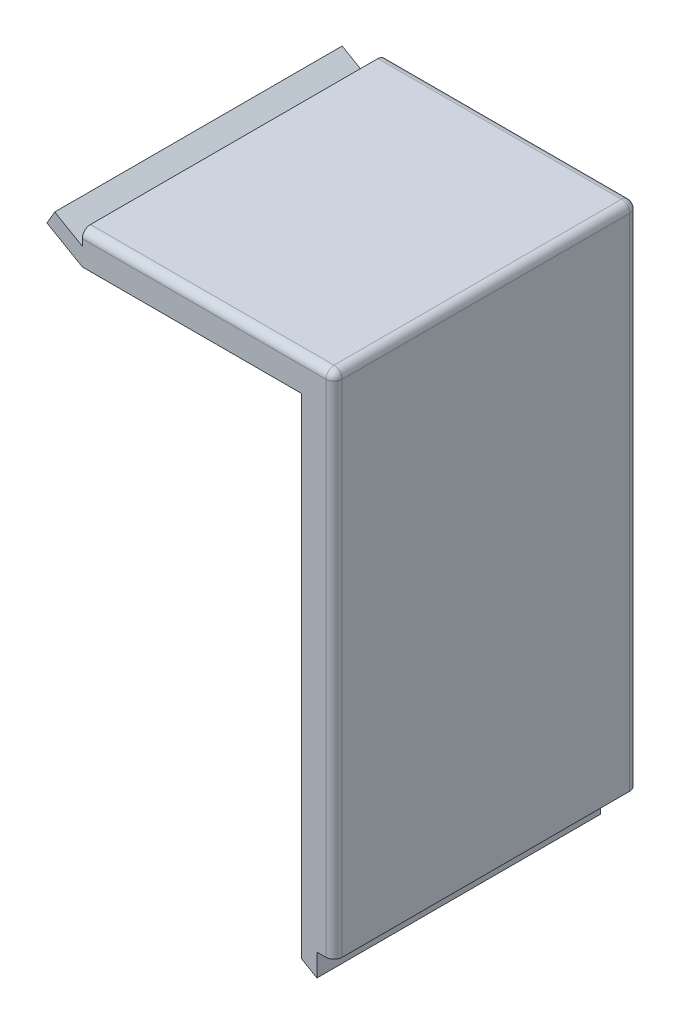
ISO-10303-21;
HEADER;
FILE_DESCRIPTION(('STEP AP214'),'2;1');
FILE_NAME('part.step','',(''),(''),'','','');
FILE_SCHEMA(('AUTOMOTIVE_DESIGN { 1 0 10303 214 1 1 1 1 }'));
ENDSEC;
DATA;
#1=APPLICATION_CONTEXT('core data for automotive mechanical design processes');
#2=APPLICATION_PROTOCOL_DEFINITION('international standard','automotive_design',2000,#1);
#3=PRODUCT_CONTEXT('',#1,'mechanical');
#4=PRODUCT('Part','Part','',(#3));
#5=PRODUCT_RELATED_PRODUCT_CATEGORY('part','',(#4));
#6=PRODUCT_DEFINITION_FORMATION('','',#4);
#7=PRODUCT_DEFINITION_CONTEXT('part definition',#1,'design');
#8=PRODUCT_DEFINITION('design','',#6,#7);
#9=PRODUCT_DEFINITION_SHAPE('','',#8);
#10=(LENGTH_UNIT() NAMED_UNIT(*) SI_UNIT(.MILLI.,.METRE.));
#11=(NAMED_UNIT(*) PLANE_ANGLE_UNIT() SI_UNIT($,.RADIAN.));
#12=(NAMED_UNIT(*) SI_UNIT($,.STERADIAN.) SOLID_ANGLE_UNIT());
#13=UNCERTAINTY_MEASURE_WITH_UNIT(LENGTH_MEASURE(1.E-05),#10,'distance_accuracy_value','');
#14=(GEOMETRIC_REPRESENTATION_CONTEXT(3) GLOBAL_UNCERTAINTY_ASSIGNED_CONTEXT((#13)) GLOBAL_UNIT_ASSIGNED_CONTEXT((#10,
#11,#12)) REPRESENTATION_CONTEXT('',''));
#15=CARTESIAN_POINT('',(0.,0.,0.));
#16=DIRECTION('',(0.,0.,1.));
#17=DIRECTION('',(1.,0.,0.));
#18=AXIS2_PLACEMENT_3D('',#15,#16,#17);
#19=CARTESIAN_POINT('',(54.4568146972271,1.89908309852391E-13,10.));
#20=DIRECTION('',(-1.,0.,0.));
#21=DIRECTION('',(0.,-1.,0.));
#22=AXIS2_PLACEMENT_3D('',#19,#20,#21);
#23=PLANE('',#22);
#24=DIRECTION('',(0.,0.,-1.));
#25=VECTOR('',#24,1.);
#26=CARTESIAN_POINT('',(54.4568146972267,119.96219663255,10.));
#27=LINE('',#26,#25);
#28=CARTESIAN_POINT('',(54.4568146972267,119.96219663255,72.5));
#29=VERTEX_POINT('',#28);
#30=CARTESIAN_POINT('',(54.4568146972267,119.96219663255,2.));
#31=VERTEX_POINT('',#30);
#32=EDGE_CURVE('E258',#29,#31,#27,.T.);
#33=ORIENTED_EDGE('',*,*,#32,.T.);
#34=CARTESIAN_POINT('',(54.4568146972267,117.96219663255,2.));
#35=DIRECTION('',(-1.,0.,0.));
#36=DIRECTION('',(0.,-1.,0.));
#37=AXIS2_PLACEMENT_3D('',#34,#35,#36);
#38=CIRCLE('',#37,2.);
#39=CARTESIAN_POINT('',(54.4568146972267,117.96219663255,0.));
#40=VERTEX_POINT('',#39);
#41=EDGE_CURVE('E295',#31,#40,#38,.T.);
#42=ORIENTED_EDGE('',*,*,#41,.T.);
#43=DIRECTION('',(0.,1.,0.));
#44=VECTOR('',#43,1.);
#45=CARTESIAN_POINT('',(54.4568146972271,1.89908309852391E-13,0.));
#46=LINE('',#45,#44);
#47=CARTESIAN_POINT('',(54.456814697227,40.3721966325497,0.));
#48=VERTEX_POINT('',#47);
#49=EDGE_CURVE('E221',#48,#40,#46,.T.);
#50=ORIENTED_EDGE('',*,*,#49,.F.);
#51=DIRECTION('',(0.,0.,-1.));
#52=VECTOR('',#51,1.);
#53=CARTESIAN_POINT('',(54.456814697227,40.3721966325497,10.));
#54=LINE('',#53,#52);
#55=CARTESIAN_POINT('',(54.456814697227,40.3721966325497,10.));
#56=VERTEX_POINT('',#55);
#57=EDGE_CURVE('E255',#56,#48,#54,.T.);
#58=ORIENTED_EDGE('',*,*,#57,.F.);
#59=DIRECTION('',(0.,1.,0.));
#60=VECTOR('',#59,1.);
#61=CARTESIAN_POINT('',(54.4568146972271,1.89908309852391E-13,10.));
#62=LINE('',#61,#60);
#63=CARTESIAN_POINT('',(54.4568146972267,111.96219663255,9.99999999999999));
#64=VERTEX_POINT('',#63);
#65=EDGE_CURVE('E242',#56,#64,#62,.T.);
#66=ORIENTED_EDGE('',*,*,#65,.T.);
#67=DIRECTION('',(0.,0.,1.));
#68=VECTOR('',#67,1.);
#69=CARTESIAN_POINT('',(54.4568146972267,111.96219663255,4.));
#70=LINE('',#69,#68);
#71=CARTESIAN_POINT('',(54.4568146972267,111.96219663255,4.));
#72=VERTEX_POINT('',#71);
#73=EDGE_CURVE('E345',#72,#64,#70,.T.);
#74=ORIENTED_EDGE('',*,*,#73,.F.);
#75=DIRECTION('',(0.,-1.,0.));
#76=VECTOR('',#75,1.);
#77=CARTESIAN_POINT('',(54.4568146972271,1.89908309852391E-13,4.));
#78=LINE('',#77,#76);
#79=CARTESIAN_POINT('',(54.4568146972267,116.350058678391,4.));
#80=VERTEX_POINT('',#79);
#81=EDGE_CURVE('E338',#80,#72,#78,.T.);
#82=ORIENTED_EDGE('',*,*,#81,.F.);
#83=DIRECTION('',(0.,0.,1.));
#84=VECTOR('',#83,1.);
#85=CARTESIAN_POINT('',(54.4568146972267,116.350058678391,4.));
#86=LINE('',#85,#84);
#87=CARTESIAN_POINT('',(54.4568146972267,116.350058678391,74.5));
#88=VERTEX_POINT('',#87);
#89=EDGE_CURVE('E341',#80,#88,#86,.T.);
#90=ORIENTED_EDGE('',*,*,#89,.T.);
#91=DIRECTION('',(0.,-1.,0.));
#92=VECTOR('',#91,1.);
#93=CARTESIAN_POINT('',(54.4568146972271,1.89908309852391E-13,74.5));
#94=LINE('',#93,#92);
#95=CARTESIAN_POINT('',(54.4568146972267,117.96219663255,74.5));
#96=VERTEX_POINT('',#95);
#97=EDGE_CURVE('E392',#96,#88,#94,.T.);
#98=ORIENTED_EDGE('',*,*,#97,.F.);
#99=CARTESIAN_POINT('',(54.4568146972267,117.96219663255,72.5));
#100=DIRECTION('',(-1.,0.,0.));
#101=DIRECTION('',(0.,-1.,0.));
#102=AXIS2_PLACEMENT_3D('',#99,#100,#101);
#103=CIRCLE('',#102,2.);
#104=EDGE_CURVE('E292',#96,#29,#103,.T.);
#105=ORIENTED_EDGE('',*,*,#104,.T.);
#106=EDGE_LOOP('',(#33,#42,#50,#58,#66,#74,#82,#90,#98,#105));
#107=FACE_BOUND('',#106,.T.);
#108=ADVANCED_FACE('F40',(#107),#23,.T.);
#109=CARTESIAN_POINT('',(0.,-4.79728263713709,10.));
#110=DIRECTION('',(0.,1.,0.));
#111=DIRECTION('',(-1.,0.,0.));
#112=AXIS2_PLACEMENT_3D('',#109,#110,#111);
#113=PLANE('',#112);
#114=DIRECTION('',(1.,0.,0.));
#115=VECTOR('',#114,1.);
#116=CARTESIAN_POINT('',(0.,-4.79728263713709,0.));
#117=LINE('',#116,#115);
#118=CARTESIAN_POINT('',(102.474735941941,-4.79728263713505,0.));
#119=VERTEX_POINT('',#118);
#120=CARTESIAN_POINT('',(114.20678674951,-4.79728263713485,0.));
#121=VERTEX_POINT('',#120);
#122=EDGE_CURVE('E58',#119,#121,#117,.T.);
#123=ORIENTED_EDGE('',*,*,#122,.T.);
#124=CARTESIAN_POINT('',(114.20678674951,-4.79728263713485,2.));
#125=DIRECTION('',(0.,1.,0.));
#126=DIRECTION('',(-1.,0.,0.));
#127=AXIS2_PLACEMENT_3D('',#124,#125,#126);
#128=CIRCLE('',#127,2.);
#129=CARTESIAN_POINT('',(116.20678674951,-4.79728263713481,2.));
#130=VERTEX_POINT('',#129);
#131=EDGE_CURVE('E271',#121,#130,#128,.F.);
#132=ORIENTED_EDGE('',*,*,#131,.T.);
#133=DIRECTION('',(0.,0.,-1.));
#134=VECTOR('',#133,1.);
#135=CARTESIAN_POINT('',(116.20678674951,-4.79728263713481,10.));
#136=LINE('',#135,#134);
#137=CARTESIAN_POINT('',(116.20678674951,-4.79728263713481,72.5));
#138=VERTEX_POINT('',#137);
#139=EDGE_CURVE('E200',#138,#130,#136,.T.);
#140=ORIENTED_EDGE('',*,*,#139,.F.);
#141=CARTESIAN_POINT('',(114.20678674951,-4.79728263713485,72.5));
#142=DIRECTION('',(0.,1.,0.));
#143=DIRECTION('',(-1.,0.,0.));
#144=AXIS2_PLACEMENT_3D('',#141,#142,#143);
#145=CIRCLE('',#144,2.);
#146=CARTESIAN_POINT('',(114.20678674951,-4.79728263713485,74.5));
#147=VERTEX_POINT('',#146);
#148=EDGE_CURVE('E268',#138,#147,#145,.F.);
#149=ORIENTED_EDGE('',*,*,#148,.T.);
#150=DIRECTION('',(1.,0.,0.));
#151=VECTOR('',#150,1.);
#152=CARTESIAN_POINT('',(0.,-4.79728263713709,74.5));
#153=LINE('',#152,#151);
#154=CARTESIAN_POINT('',(112.006786749508,-4.79728263713489,74.5));
#155=VERTEX_POINT('',#154);
#156=EDGE_CURVE('E388',#155,#147,#153,.T.);
#157=ORIENTED_EDGE('',*,*,#156,.F.);
#158=DIRECTION('',(0.,0.,1.));
#159=VECTOR('',#158,1.);
#160=CARTESIAN_POINT('',(112.006786749508,-4.7972826371349,74.5));
#161=LINE('',#160,#159);
#162=CARTESIAN_POINT('',(112.006786749508,-4.7972826371349,5.));
#163=VERTEX_POINT('',#162);
#164=EDGE_CURVE('E368',#163,#155,#161,.T.);
#165=ORIENTED_EDGE('',*,*,#164,.F.);
#166=DIRECTION('',(1.,0.,0.));
#167=VECTOR('',#166,1.);
#168=CARTESIAN_POINT('',(108.206786749508,-4.79728263713497,5.));
#169=LINE('',#168,#167);
#170=CARTESIAN_POINT('',(108.206786749508,-4.79728263713497,5.));
#171=VERTEX_POINT('',#170);
#172=EDGE_CURVE('E365',#171,#163,#169,.T.);
#173=ORIENTED_EDGE('',*,*,#172,.F.);
#174=DIRECTION('',(0.,0.,-1.));
#175=VECTOR('',#174,1.);
#176=CARTESIAN_POINT('',(108.206786749508,-4.79728263713497,74.5));
#177=LINE('',#176,#175);
#178=CARTESIAN_POINT('',(108.206786749508,-4.79728263713497,9.99999999999999));
#179=VERTEX_POINT('',#178);
#180=EDGE_CURVE('E195',#179,#171,#177,.T.);
#181=ORIENTED_EDGE('',*,*,#180,.F.);
#182=DIRECTION('',(1.,0.,0.));
#183=VECTOR('',#182,1.);
#184=CARTESIAN_POINT('',(0.,-4.79728263713709,10.));
#185=LINE('',#184,#183);
#186=CARTESIAN_POINT('',(102.474735941941,-4.79728263713504,9.99999999999999));
#187=VERTEX_POINT('',#186);
#188=EDGE_CURVE('E189',#187,#179,#185,.T.);
#189=ORIENTED_EDGE('',*,*,#188,.F.);
#190=DIRECTION('',(0.,0.,-1.));
#191=VECTOR('',#190,1.);
#192=CARTESIAN_POINT('',(102.474735941941,-4.79728263713504,74.501));
#193=LINE('',#192,#191);
#194=EDGE_CURVE('E192',#187,#119,#193,.T.);
#195=ORIENTED_EDGE('',*,*,#194,.T.);
#196=EDGE_LOOP('',(#123,#132,#140,#149,#157,#165,#173,#181,#189,#195));
#197=FACE_BOUND('',#196,.T.);
#198=ADVANCED_FACE('F191',(#197),#113,.F.);
#199=CARTESIAN_POINT('',(0.,0.,10.));
#200=DIRECTION('',(0.,0.,1.));
#201=DIRECTION('',(1.,0.,0.));
#202=AXIS2_PLACEMENT_3D('',#199,#200,#201);
#203=PLANE('',#202);
#204=DIRECTION('',(0.866025403784446,-0.499999999999987,0.));
#205=VECTOR('',#204,1.);
#206=CARTESIAN_POINT('',(23.5413996690376,40.7749003080596,10.));
#207=LINE('',#206,#205);
#208=CARTESIAN_POINT('',(69.5657705981324,14.2027173628645,10.));
#209=VERTEX_POINT('',#208);
#210=EDGE_CURVE('E201',#209,#187,#207,.T.);
#211=ORIENTED_EDGE('',*,*,#210,.T.);
#212=ORIENTED_EDGE('',*,*,#188,.T.);
#213=DIRECTION('',(0.,1.,0.));
#214=VECTOR('',#213,1.);
#215=CARTESIAN_POINT('',(108.206786749508,0.,10.));
#216=LINE('',#215,#214);
#217=CARTESIAN_POINT('',(108.206786749508,111.96219663255,10.));
#218=VERTEX_POINT('',#217);
#219=EDGE_CURVE('E383',#179,#218,#216,.T.);
#220=ORIENTED_EDGE('',*,*,#219,.T.);
#221=DIRECTION('',(1.,0.,0.));
#222=VECTOR('',#221,1.);
#223=CARTESIAN_POINT('',(0.,111.96219663255,10.));
#224=LINE('',#223,#222);
#225=EDGE_CURVE('E389',#64,#218,#224,.T.);
#226=ORIENTED_EDGE('',*,*,#225,.F.);
#227=ORIENTED_EDGE('',*,*,#65,.F.);
#228=DIRECTION('',(1.,0.,0.));
#229=VECTOR('',#228,1.);
#230=CARTESIAN_POINT('',(-6.91376316339102E-13,40.3721966325488,10.));
#231=LINE('',#230,#229);
#232=CARTESIAN_POINT('',(46.5547264990387,40.3721966325496,10.));
#233=VERTEX_POINT('',#232);
#234=EDGE_CURVE('E413',#233,#56,#231,.T.);
#235=ORIENTED_EDGE('',*,*,#234,.F.);
#236=DIRECTION('',(0.499999999999984,-0.866025403784448,0.));
#237=VECTOR('',#236,1.);
#238=CARTESIAN_POINT('',(52.3977188194636,30.2518370653384,10.));
#239=LINE('',#238,#237);
#240=CARTESIAN_POINT('',(65.6147264990377,7.35930824028713,10.));
#241=VERTEX_POINT('',#240);
#242=EDGE_CURVE('E217',#233,#241,#239,.T.);
#243=ORIENTED_EDGE('',*,*,#242,.T.);
#244=DIRECTION('',(-0.499999999999991,-0.866025403784444,0.));
#245=VECTOR('',#244,1.);
#246=CARTESIAN_POINT('',(46.0243709290945,-26.5721829451953,10.));
#247=LINE('',#246,#245);
#248=EDGE_CURVE('E213',#209,#241,#247,.T.);
#249=ORIENTED_EDGE('',*,*,#248,.F.);
#250=EDGE_LOOP('',(#211,#212,#220,#226,#227,#235,#243,#249));
#251=FACE_BOUND('',#250,.T.);
#252=ADVANCED_FACE('F211',(#251),#203,.T.);
#253=CARTESIAN_POINT('',(116.20678674951,1.87433055169684E-12,10.));
#254=DIRECTION('',(1.,0.,0.));
#255=DIRECTION('',(0.,1.,0.));
#256=AXIS2_PLACEMENT_3D('',#253,#254,#255);
#257=PLANE('',#256);
#258=ORIENTED_EDGE('',*,*,#139,.T.);
#259=DIRECTION('',(0.,-1.,0.));
#260=VECTOR('',#259,1.);
#261=CARTESIAN_POINT('',(116.206786749508,119.96219663255,2.));
#262=LINE('',#261,#260);
#263=CARTESIAN_POINT('',(116.206786749508,117.96219663255,2.));
#264=VERTEX_POINT('',#263);
#265=EDGE_CURVE('E280',#130,#264,#262,.F.);
#266=ORIENTED_EDGE('',*,*,#265,.T.);
#267=DIRECTION('',(0.,0.,-1.));
#268=VECTOR('',#267,1.);
#269=CARTESIAN_POINT('',(116.206786749508,117.96219663255,10.));
#270=LINE('',#269,#268);
#271=CARTESIAN_POINT('',(116.206786749508,117.96219663255,72.5));
#272=VERTEX_POINT('',#271);
#273=EDGE_CURVE('E277',#264,#272,#270,.F.);
#274=ORIENTED_EDGE('',*,*,#273,.T.);
#275=DIRECTION('',(0.,1.,0.));
#276=VECTOR('',#275,1.);
#277=CARTESIAN_POINT('',(116.20678674951,1.87433055169684E-12,72.5));
#278=LINE('',#277,#276);
#279=EDGE_CURVE('E274',#272,#138,#278,.F.);
#280=ORIENTED_EDGE('',*,*,#279,.T.);
#281=EDGE_LOOP('',(#258,#266,#274,#280));
#282=FACE_BOUND('',#281,.T.);
#283=ADVANCED_FACE('F450',(#282),#257,.T.);
#284=CARTESIAN_POINT('',(0.,119.96219663255,10.));
#285=DIRECTION('',(0.,1.,0.));
#286=DIRECTION('',(0.,0.,1.));
#287=AXIS2_PLACEMENT_3D('',#284,#285,#286);
#288=PLANE('',#287);
#289=DIRECTION('',(0.,0.,-1.));
#290=VECTOR('',#289,1.);
#291=CARTESIAN_POINT('',(114.206786749508,119.96219663255,10.));
#292=LINE('',#291,#290);
#293=CARTESIAN_POINT('',(114.206786749508,119.96219663255,72.5));
#294=VERTEX_POINT('',#293);
#295=CARTESIAN_POINT('',(114.206786749508,119.96219663255,2.));
#296=VERTEX_POINT('',#295);
#297=EDGE_CURVE('E286',#294,#296,#292,.T.);
#298=ORIENTED_EDGE('',*,*,#297,.T.);
#299=DIRECTION('',(1.,0.,0.));
#300=VECTOR('',#299,1.);
#301=CARTESIAN_POINT('',(54.4568146972267,119.96219663255,2.));
#302=LINE('',#301,#300);
#303=EDGE_CURVE('E289',#296,#31,#302,.F.);
#304=ORIENTED_EDGE('',*,*,#303,.T.);
#305=ORIENTED_EDGE('',*,*,#32,.F.);
#306=DIRECTION('',(-1.,0.,0.));
#307=VECTOR('',#306,1.);
#308=CARTESIAN_POINT('',(0.,119.96219663255,72.5));
#309=LINE('',#308,#307);
#310=EDGE_CURVE('E283',#29,#294,#309,.F.);
#311=ORIENTED_EDGE('',*,*,#310,.T.);
#312=EDGE_LOOP('',(#298,#304,#305,#311));
#313=FACE_BOUND('',#312,.T.);
#314=ADVANCED_FACE('F489',(#313),#288,.T.);
#315=CARTESIAN_POINT('',(-6.91376316339102E-13,40.3721966325488,10.));
#316=DIRECTION('',(0.,1.,0.));
#317=DIRECTION('',(-1.,0.,0.));
#318=AXIS2_PLACEMENT_3D('',#315,#316,#317);
#319=PLANE('',#318);
#320=DIRECTION('',(1.,0.,0.));
#321=VECTOR('',#320,1.);
#322=CARTESIAN_POINT('',(-6.91376316339102E-13,40.3721966325488,0.));
#323=LINE('',#322,#321);
#324=CARTESIAN_POINT('',(46.5547264990387,40.3721966325496,0.));
#325=VERTEX_POINT('',#324);
#326=EDGE_CURVE('E225',#325,#48,#323,.T.);
#327=ORIENTED_EDGE('',*,*,#326,.F.);
#328=DIRECTION('',(0.,0.,-1.));
#329=VECTOR('',#328,1.);
#330=CARTESIAN_POINT('',(46.5547264990387,40.3721966325496,10.));
#331=LINE('',#330,#329);
#332=EDGE_CURVE('E252',#233,#325,#331,.T.);
#333=ORIENTED_EDGE('',*,*,#332,.F.);
#334=ORIENTED_EDGE('',*,*,#234,.T.);
#335=ORIENTED_EDGE('',*,*,#57,.T.);
#336=EDGE_LOOP('',(#327,#333,#334,#335));
#337=FACE_BOUND('',#336,.T.);
#338=ADVANCED_FACE('F430',(#337),#319,.T.);
#339=CARTESIAN_POINT('',(52.3977188194636,30.2518370653384,10.));
#340=DIRECTION('',(0.866025403784448,0.499999999999984,0.));
#341=DIRECTION('',(-0.499999999999984,0.866025403784448,0.));
#342=AXIS2_PLACEMENT_3D('',#339,#340,#341);
#343=PLANE('',#342);
#344=DIRECTION('',(0.499999999999984,-0.866025403784448,0.));
#345=VECTOR('',#344,1.);
#346=CARTESIAN_POINT('',(52.3977188194636,30.2518370653384,0.));
#347=LINE('',#346,#345);
#348=CARTESIAN_POINT('',(65.6147264990377,7.35930824028713,0.));
#349=VERTEX_POINT('',#348);
#350=EDGE_CURVE('E230',#325,#349,#347,.T.);
#351=ORIENTED_EDGE('',*,*,#350,.T.);
#352=DIRECTION('',(0.,0.,-1.));
#353=VECTOR('',#352,1.);
#354=CARTESIAN_POINT('',(65.6147264990377,7.35930824028713,10.));
#355=LINE('',#354,#353);
#356=EDGE_CURVE('E249',#241,#349,#355,.T.);
#357=ORIENTED_EDGE('',*,*,#356,.F.);
#358=ORIENTED_EDGE('',*,*,#242,.F.);
#359=ORIENTED_EDGE('',*,*,#332,.T.);
#360=EDGE_LOOP('',(#351,#357,#358,#359));
#361=FACE_BOUND('',#360,.T.);
#362=ADVANCED_FACE('F422',(#361),#343,.F.);
#363=CARTESIAN_POINT('',(46.0243709290945,-26.5721829451953,10.));
#364=DIRECTION('',(0.866025403784444,-0.499999999999991,0.));
#365=DIRECTION('',(0.499999999999991,0.866025403784444,0.));
#366=AXIS2_PLACEMENT_3D('',#363,#364,#365);
#367=PLANE('',#366);
#368=DIRECTION('',(-0.499999999999991,-0.866025403784444,0.));
#369=VECTOR('',#368,1.);
#370=CARTESIAN_POINT('',(46.0243709290945,-26.5721829451953,0.));
#371=LINE('',#370,#369);
#372=CARTESIAN_POINT('',(69.5657705981324,14.2027173628645,0.));
#373=VERTEX_POINT('',#372);
#374=EDGE_CURVE('E234',#373,#349,#371,.T.);
#375=ORIENTED_EDGE('',*,*,#374,.F.);
#376=DIRECTION('',(0.,0.,-1.));
#377=VECTOR('',#376,1.);
#378=CARTESIAN_POINT('',(69.5657705981324,14.2027173628645,10.));
#379=LINE('',#378,#377);
#380=EDGE_CURVE('E246',#209,#373,#379,.T.);
#381=ORIENTED_EDGE('',*,*,#380,.F.);
#382=ORIENTED_EDGE('',*,*,#248,.T.);
#383=ORIENTED_EDGE('',*,*,#356,.T.);
#384=EDGE_LOOP('',(#375,#381,#382,#383));
#385=FACE_BOUND('',#384,.T.);
#386=ADVANCED_FACE('F426',(#385),#367,.T.);
#387=CARTESIAN_POINT('',(23.5413996690376,40.7749003080596,10.));
#388=DIRECTION('',(0.499999999999987,0.866025403784446,0.));
#389=DIRECTION('',(-0.866025403784446,0.499999999999987,0.));
#390=AXIS2_PLACEMENT_3D('',#387,#388,#389);
#391=PLANE('',#390);
#392=DIRECTION('',(0.866025403784446,-0.499999999999987,0.));
#393=VECTOR('',#392,1.);
#394=CARTESIAN_POINT('',(23.5413996690376,40.7749003080596,0.));
#395=LINE('',#394,#393);
#396=EDGE_CURVE('E207',#373,#119,#395,.T.);
#397=ORIENTED_EDGE('',*,*,#396,.T.);
#398=ORIENTED_EDGE('',*,*,#194,.F.);
#399=ORIENTED_EDGE('',*,*,#210,.F.);
#400=ORIENTED_EDGE('',*,*,#380,.T.);
#401=EDGE_LOOP('',(#397,#398,#399,#400));
#402=FACE_BOUND('',#401,.T.);
#403=ADVANCED_FACE('F205',(#402),#391,.F.);
#404=CARTESIAN_POINT('',(0.,0.,0.));
#405=DIRECTION('',(0.,0.,1.));
#406=DIRECTION('',(1.,0.,0.));
#407=AXIS2_PLACEMENT_3D('',#404,#405,#406);
#408=PLANE('',#407);
#409=ORIENTED_EDGE('',*,*,#122,.F.);
#410=ORIENTED_EDGE('',*,*,#396,.F.);
#411=ORIENTED_EDGE('',*,*,#374,.T.);
#412=ORIENTED_EDGE('',*,*,#350,.F.);
#413=ORIENTED_EDGE('',*,*,#326,.T.);
#414=ORIENTED_EDGE('',*,*,#49,.T.);
#415=DIRECTION('',(1.,0.,0.));
#416=VECTOR('',#415,1.);
#417=CARTESIAN_POINT('',(116.206786749508,117.96219663255,0.));
#418=LINE('',#417,#416);
#419=CARTESIAN_POINT('',(114.206786749508,117.96219663255,0.));
#420=VERTEX_POINT('',#419);
#421=EDGE_CURVE('E262',#40,#420,#418,.T.);
#422=ORIENTED_EDGE('',*,*,#421,.T.);
#423=DIRECTION('',(0.,-1.,0.));
#424=VECTOR('',#423,1.);
#425=CARTESIAN_POINT('',(114.20678674951,-4.79728263713484,0.));
#426=LINE('',#425,#424);
#427=EDGE_CURVE('E265',#420,#121,#426,.T.);
#428=ORIENTED_EDGE('',*,*,#427,.T.);
#429=EDGE_LOOP('',(#409,#410,#411,#412,#413,#414,#422,#428));
#430=FACE_BOUND('',#429,.T.);
#431=ADVANCED_FACE('F427',(#430),#408,.F.);
#432=CARTESIAN_POINT('',(108.206786749508,0.,74.5));
#433=DIRECTION('',(-1.,0.,0.));
#434=DIRECTION('',(0.,0.,1.));
#435=AXIS2_PLACEMENT_3D('',#432,#433,#434);
#436=PLANE('',#435);
#437=ORIENTED_EDGE('',*,*,#219,.F.);
#438=ORIENTED_EDGE('',*,*,#180,.T.);
#439=DIRECTION('',(0.,1.,0.));
#440=VECTOR('',#439,1.);
#441=CARTESIAN_POINT('',(108.206786749508,-5.79728263713497,5.));
#442=LINE('',#441,#440);
#443=CARTESIAN_POINT('',(108.206786749508,-8.10668371389305,5.));
#444=VERTEX_POINT('',#443);
#445=EDGE_CURVE('E379',#444,#171,#442,.T.);
#446=ORIENTED_EDGE('',*,*,#445,.F.);
#447=DIRECTION('',(0.,0.,-1.));
#448=VECTOR('',#447,1.);
#449=CARTESIAN_POINT('',(108.206786749508,-8.10668371389305,80.3923679450622));
#450=LINE('',#449,#448);
#451=CARTESIAN_POINT('',(108.206786749508,-8.10668371389305,74.5));
#452=VERTEX_POINT('',#451);
#453=EDGE_CURVE('E356',#452,#444,#450,.T.);
#454=ORIENTED_EDGE('',*,*,#453,.F.);
#455=DIRECTION('',(0.,1.,0.));
#456=VECTOR('',#455,1.);
#457=CARTESIAN_POINT('',(108.206786749508,0.,74.5));
#458=LINE('',#457,#456);
#459=CARTESIAN_POINT('',(108.206786749508,111.96219663255,74.5));
#460=VERTEX_POINT('',#459);
#461=EDGE_CURVE('E384',#452,#460,#458,.T.);
#462=ORIENTED_EDGE('',*,*,#461,.T.);
#463=DIRECTION('',(0.,0.,-1.));
#464=VECTOR('',#463,1.);
#465=CARTESIAN_POINT('',(108.206786749508,111.96219663255,74.5));
#466=LINE('',#465,#464);
#467=EDGE_CURVE('E398',#460,#218,#466,.T.);
#468=ORIENTED_EDGE('',*,*,#467,.T.);
#469=EDGE_LOOP('',(#437,#438,#446,#454,#462,#468));
#470=FACE_BOUND('',#469,.T.);
#471=ADVANCED_FACE('F466',(#470),#436,.T.);
#472=CARTESIAN_POINT('',(0.,111.96219663255,74.5));
#473=DIRECTION('',(0.,1.,0.));
#474=DIRECTION('',(0.,0.,1.));
#475=AXIS2_PLACEMENT_3D('',#472,#473,#474);
#476=PLANE('',#475);
#477=ORIENTED_EDGE('',*,*,#225,.T.);
#478=ORIENTED_EDGE('',*,*,#467,.F.);
#479=DIRECTION('',(1.,0.,0.));
#480=VECTOR('',#479,1.);
#481=CARTESIAN_POINT('',(0.,111.96219663255,74.5));
#482=LINE('',#481,#480);
#483=CARTESIAN_POINT('',(54.4568146972267,111.96219663255,74.5));
#484=VERTEX_POINT('',#483);
#485=EDGE_CURVE('E395',#484,#460,#482,.T.);
#486=ORIENTED_EDGE('',*,*,#485,.F.);
#487=DIRECTION('',(0.,0.,-1.));
#488=VECTOR('',#487,1.);
#489=CARTESIAN_POINT('',(54.4568146972267,111.96219663255,74.5));
#490=LINE('',#489,#488);
#491=EDGE_CURVE('E226',#484,#64,#490,.T.);
#492=ORIENTED_EDGE('',*,*,#491,.T.);
#493=EDGE_LOOP('',(#477,#478,#486,#492));
#494=FACE_BOUND('',#493,.T.);
#495=ADVANCED_FACE('F552',(#494),#476,.F.);
#496=CARTESIAN_POINT('',(0.,0.,74.5));
#497=DIRECTION('',(0.,0.,1.));
#498=DIRECTION('',(1.,0.,0.));
#499=AXIS2_PLACEMENT_3D('',#496,#497,#498);
#500=PLANE('',#499);
#501=DIRECTION('',(0.,1.,0.));
#502=VECTOR('',#501,1.);
#503=CARTESIAN_POINT('',(114.20678674951,1.84207201320482E-12,74.5));
#504=LINE('',#503,#502);
#505=CARTESIAN_POINT('',(114.206786749508,117.96219663255,74.5));
#506=VERTEX_POINT('',#505);
#507=EDGE_CURVE('E50',#147,#506,#504,.T.);
#508=ORIENTED_EDGE('',*,*,#507,.T.);
#509=DIRECTION('',(-1.,0.,0.));
#510=VECTOR('',#509,1.);
#511=CARTESIAN_POINT('',(0.,117.96219663255,74.5));
#512=LINE('',#511,#510);
#513=EDGE_CURVE('E11',#506,#96,#512,.T.);
#514=ORIENTED_EDGE('',*,*,#513,.T.);
#515=ORIENTED_EDGE('',*,*,#97,.T.);
#516=DIRECTION('',(0.86602540378444,-0.499999999999999,0.));
#517=VECTOR('',#516,1.);
#518=CARTESIAN_POINT('',(63.9952569479548,110.843036477283,74.5));
#519=LINE('',#518,#517);
#520=CARTESIAN_POINT('',(47.6965606593823,120.253093166931,74.5));
#521=VERTEX_POINT('',#520);
#522=EDGE_CURVE('E324',#521,#88,#519,.T.);
#523=ORIENTED_EDGE('',*,*,#522,.F.);
#524=DIRECTION('',(0.499999999999998,0.86602540378444,0.));
#525=VECTOR('',#524,1.);
#526=CARTESIAN_POINT('',(45.7965606593823,116.96219663255,74.5));
#527=LINE('',#526,#525);
#528=CARTESIAN_POINT('',(45.7965606593823,116.96219663255,74.5));
#529=VERTEX_POINT('',#528);
#530=EDGE_CURVE('E209',#529,#521,#527,.T.);
#531=ORIENTED_EDGE('',*,*,#530,.F.);
#532=DIRECTION('',(-0.86602540378444,0.499999999999999,0.));
#533=VECTOR('',#532,1.);
#534=CARTESIAN_POINT('',(62.0952569479548,107.552139942902,74.5));
#535=LINE('',#534,#533);
#536=EDGE_CURVE('E328',#484,#529,#535,.T.);
#537=ORIENTED_EDGE('',*,*,#536,.F.);
#538=ORIENTED_EDGE('',*,*,#485,.T.);
#539=ORIENTED_EDGE('',*,*,#461,.F.);
#540=DIRECTION('',(-0.866025403784438,0.5,0.));
#541=VECTOR('',#540,1.);
#542=CARTESIAN_POINT('',(108.206786749508,-8.10668371389305,74.5));
#543=LINE('',#542,#541);
#544=CARTESIAN_POINT('',(112.006786749508,-10.3006147368136,74.5));
#545=VERTEX_POINT('',#544);
#546=EDGE_CURVE('E352',#545,#452,#543,.T.);
#547=ORIENTED_EDGE('',*,*,#546,.F.);
#548=DIRECTION('',(0.,1.,0.));
#549=VECTOR('',#548,1.);
#550=CARTESIAN_POINT('',(112.006786749508,-5.7972826371349,74.5));
#551=LINE('',#550,#549);
#552=EDGE_CURVE('E372',#545,#155,#551,.T.);
#553=ORIENTED_EDGE('',*,*,#552,.T.);
#554=ORIENTED_EDGE('',*,*,#156,.T.);
#555=EDGE_LOOP('',(#508,#514,#515,#523,#531,#537,#538,#539,#547,#553,#554));
#556=FACE_BOUND('',#555,.T.);
#557=ADVANCED_FACE('F456',(#556),#500,.T.);
#558=CARTESIAN_POINT('',(108.206786749508,-5.79728263713497,5.));
#559=DIRECTION('',(0.,0.,1.));
#560=DIRECTION('',(1.,0.,0.));
#561=AXIS2_PLACEMENT_3D('',#558,#559,#560);
#562=PLANE('',#561);
#563=ORIENTED_EDGE('',*,*,#172,.T.);
#564=DIRECTION('',(0.,1.,0.));
#565=VECTOR('',#564,1.);
#566=CARTESIAN_POINT('',(112.006786749508,-5.7972826371349,5.));
#567=LINE('',#566,#565);
#568=CARTESIAN_POINT('',(112.006786749508,-10.3006147368136,5.));
#569=VERTEX_POINT('',#568);
#570=EDGE_CURVE('E375',#569,#163,#567,.T.);
#571=ORIENTED_EDGE('',*,*,#570,.F.);
#572=DIRECTION('',(-0.866025403784438,0.5,0.));
#573=VECTOR('',#572,1.);
#574=CARTESIAN_POINT('',(108.206786749508,-8.10668371389305,5.));
#575=LINE('',#574,#573);
#576=EDGE_CURVE('E344',#569,#444,#575,.T.);
#577=ORIENTED_EDGE('',*,*,#576,.T.);
#578=ORIENTED_EDGE('',*,*,#445,.T.);
#579=EDGE_LOOP('',(#563,#571,#577,#578));
#580=FACE_BOUND('',#579,.T.);
#581=ADVANCED_FACE('F462',(#580),#562,.F.);
#582=CARTESIAN_POINT('',(112.006786749508,-5.7972826371349,74.5));
#583=DIRECTION('',(-1.,0.,0.));
#584=DIRECTION('',(0.,-1.,0.));
#585=AXIS2_PLACEMENT_3D('',#582,#583,#584);
#586=PLANE('',#585);
#587=ORIENTED_EDGE('',*,*,#164,.T.);
#588=ORIENTED_EDGE('',*,*,#552,.F.);
#589=DIRECTION('',(0.,0.,-1.));
#590=VECTOR('',#589,1.);
#591=CARTESIAN_POINT('',(112.006786749508,-10.3006147368136,80.3923679450622));
#592=LINE('',#591,#590);
#593=EDGE_CURVE('E351',#545,#569,#592,.T.);
#594=ORIENTED_EDGE('',*,*,#593,.T.);
#595=ORIENTED_EDGE('',*,*,#570,.T.);
#596=EDGE_LOOP('',(#587,#588,#594,#595));
#597=FACE_BOUND('',#596,.T.);
#598=ADVANCED_FACE('F460',(#597),#586,.F.);
#599=CARTESIAN_POINT('',(108.206786749508,-8.10668371389305,80.3923679450622));
#600=DIRECTION('',(-0.5,-0.866025403784438,0.));
#601=DIRECTION('',(0.866025403784438,-0.5,0.));
#602=AXIS2_PLACEMENT_3D('',#599,#600,#601);
#603=PLANE('',#602);
#604=ORIENTED_EDGE('',*,*,#593,.F.);
#605=ORIENTED_EDGE('',*,*,#546,.T.);
#606=ORIENTED_EDGE('',*,*,#453,.T.);
#607=ORIENTED_EDGE('',*,*,#576,.F.);
#608=EDGE_LOOP('',(#604,#605,#606,#607));
#609=FACE_BOUND('',#608,.T.);
#610=ADVANCED_FACE('F468',(#609),#603,.T.);
#611=CARTESIAN_POINT('',(63.9952569479548,110.843036477283,4.));
#612=DIRECTION('',(-0.499999999999999,-0.866025403784439,0.));
#613=DIRECTION('',(0.866025403784439,-0.499999999999999,0.));
#614=AXIS2_PLACEMENT_3D('',#611,#612,#613);
#615=PLANE('',#614);
#616=ORIENTED_EDGE('',*,*,#522,.T.);
#617=ORIENTED_EDGE('',*,*,#89,.F.);
#618=DIRECTION('',(0.86602540378444,-0.499999999999999,0.));
#619=VECTOR('',#618,1.);
#620=CARTESIAN_POINT('',(63.9952569479548,110.843036477283,4.));
#621=LINE('',#620,#619);
#622=CARTESIAN_POINT('',(47.6965606593823,120.253093166931,4.));
#623=VERTEX_POINT('',#622);
#624=EDGE_CURVE('E335',#623,#80,#621,.T.);
#625=ORIENTED_EDGE('',*,*,#624,.F.);
#626=DIRECTION('',(0.,0.,-1.));
#627=VECTOR('',#626,1.);
#628=CARTESIAN_POINT('',(47.6965606593823,120.253093166931,74.5));
#629=LINE('',#628,#627);
#630=EDGE_CURVE('E524',#521,#623,#629,.T.);
#631=ORIENTED_EDGE('',*,*,#630,.F.);
#632=EDGE_LOOP('',(#616,#617,#625,#631));
#633=FACE_BOUND('',#632,.T.);
#634=ADVANCED_FACE('F470',(#633),#615,.F.);
#635=CARTESIAN_POINT('',(62.0952569479548,107.552139942902,4.));
#636=DIRECTION('',(0.499999999999999,0.866025403784439,0.));
#637=DIRECTION('',(-0.866025403784439,0.499999999999999,0.));
#638=AXIS2_PLACEMENT_3D('',#635,#636,#637);
#639=PLANE('',#638);
#640=ORIENTED_EDGE('',*,*,#536,.T.);
#641=DIRECTION('',(0.,0.,1.));
#642=VECTOR('',#641,1.);
#643=CARTESIAN_POINT('',(45.7965606593823,116.96219663255,74.5));
#644=LINE('',#643,#642);
#645=CARTESIAN_POINT('',(45.7965606593823,116.96219663255,4.));
#646=VERTEX_POINT('',#645);
#647=EDGE_CURVE('E305',#646,#529,#644,.T.);
#648=ORIENTED_EDGE('',*,*,#647,.F.);
#649=DIRECTION('',(-0.86602540378444,0.499999999999999,0.));
#650=VECTOR('',#649,1.);
#651=CARTESIAN_POINT('',(62.0952569479548,107.552139942902,4.));
#652=LINE('',#651,#650);
#653=EDGE_CURVE('E541',#72,#646,#652,.T.);
#654=ORIENTED_EDGE('',*,*,#653,.F.);
#655=ORIENTED_EDGE('',*,*,#73,.T.);
#656=ORIENTED_EDGE('',*,*,#491,.F.);
#657=EDGE_LOOP('',(#640,#648,#654,#655,#656));
#658=FACE_BOUND('',#657,.T.);
#659=ADVANCED_FACE('F476',(#658),#639,.F.);
#660=CARTESIAN_POINT('',(0.,0.,4.));
#661=DIRECTION('',(0.,0.,1.));
#662=DIRECTION('',(1.,0.,0.));
#663=AXIS2_PLACEMENT_3D('',#660,#661,#662);
#664=PLANE('',#663);
#665=ORIENTED_EDGE('',*,*,#624,.T.);
#666=ORIENTED_EDGE('',*,*,#81,.T.);
#667=ORIENTED_EDGE('',*,*,#653,.T.);
#668=DIRECTION('',(-0.499999999999998,-0.86602540378444,0.));
#669=VECTOR('',#668,1.);
#670=CARTESIAN_POINT('',(45.7965606593823,116.96219663255,4.));
#671=LINE('',#670,#669);
#672=EDGE_CURVE('E529',#623,#646,#671,.T.);
#673=ORIENTED_EDGE('',*,*,#672,.F.);
#674=EDGE_LOOP('',(#665,#666,#667,#673));
#675=FACE_BOUND('',#674,.T.);
#676=ADVANCED_FACE('F514',(#675),#664,.F.);
#677=CARTESIAN_POINT('',(114.20678674951,1.84207201320482E-12,72.5));
#678=DIRECTION('',(0.,1.,0.));
#679=DIRECTION('',(-1.,0.,0.));
#680=AXIS2_PLACEMENT_3D('',#677,#678,#679);
#681=CYLINDRICAL_SURFACE('',#680,2.);
#682=ORIENTED_EDGE('',*,*,#148,.F.);
#683=ORIENTED_EDGE('',*,*,#279,.F.);
#684=CARTESIAN_POINT('',(114.206786749508,117.96219663255,72.5));
#685=DIRECTION('',(0.,1.,0.));
#686=DIRECTION('',(-1.,0.,0.));
#687=AXIS2_PLACEMENT_3D('',#684,#685,#686);
#688=CIRCLE('',#687,2.);
#689=EDGE_CURVE('E44',#506,#272,#688,.T.);
#690=ORIENTED_EDGE('',*,*,#689,.F.);
#691=ORIENTED_EDGE('',*,*,#507,.F.);
#692=EDGE_LOOP('',(#682,#683,#690,#691));
#693=FACE_BOUND('',#692,.T.);
#694=ADVANCED_FACE('F42',(#693),#681,.T.);
#695=CARTESIAN_POINT('',(0.,117.96219663255,72.5));
#696=DIRECTION('',(-1.,0.,0.));
#697=DIRECTION('',(0.,0.,1.));
#698=AXIS2_PLACEMENT_3D('',#695,#696,#697);
#699=CYLINDRICAL_SURFACE('',#698,2.);
#700=ORIENTED_EDGE('',*,*,#104,.F.);
#701=ORIENTED_EDGE('',*,*,#513,.F.);
#702=CARTESIAN_POINT('',(114.206786749508,117.96219663255,72.5));
#703=DIRECTION('',(1.,0.,0.));
#704=DIRECTION('',(0.,0.,-1.));
#705=AXIS2_PLACEMENT_3D('',#702,#703,#704);
#706=CIRCLE('',#705,2.);
#707=EDGE_CURVE('E316',#294,#506,#706,.T.);
#708=ORIENTED_EDGE('',*,*,#707,.F.);
#709=ORIENTED_EDGE('',*,*,#310,.F.);
#710=EDGE_LOOP('',(#700,#701,#708,#709));
#711=FACE_BOUND('',#710,.T.);
#712=ADVANCED_FACE('F508',(#711),#699,.T.);
#713=CARTESIAN_POINT('',(114.206786749508,117.96219663255,72.5));
#714=DIRECTION('',(0.,0.,1.));
#715=DIRECTION('',(1.,0.,0.));
#716=AXIS2_PLACEMENT_3D('',#713,#714,#715);
#717=SPHERICAL_SURFACE('',#716,2.);
#718=ORIENTED_EDGE('',*,*,#707,.T.);
#719=ORIENTED_EDGE('',*,*,#689,.T.);
#720=CARTESIAN_POINT('',(114.206786749508,117.96219663255,72.5));
#721=DIRECTION('',(0.,0.,1.));
#722=DIRECTION('',(1.,0.,0.));
#723=AXIS2_PLACEMENT_3D('',#720,#721,#722);
#724=CIRCLE('',#723,2.);
#725=EDGE_CURVE('E313',#294,#272,#724,.F.);
#726=ORIENTED_EDGE('',*,*,#725,.F.);
#727=EDGE_LOOP('',(#718,#719,#726));
#728=FACE_BOUND('',#727,.T.);
#729=ADVANCED_FACE('F505',(#728),#717,.T.);
#730=CARTESIAN_POINT('',(114.206786749508,117.96219663255,10.));
#731=DIRECTION('',(0.,0.,-1.));
#732=DIRECTION('',(-1.,0.,0.));
#733=AXIS2_PLACEMENT_3D('',#730,#731,#732);
#734=CYLINDRICAL_SURFACE('',#733,2.);
#735=ORIENTED_EDGE('',*,*,#725,.T.);
#736=ORIENTED_EDGE('',*,*,#273,.F.);
#737=CARTESIAN_POINT('',(114.206786749508,117.96219663255,2.));
#738=DIRECTION('',(0.,0.,-1.));
#739=DIRECTION('',(-1.,0.,0.));
#740=AXIS2_PLACEMENT_3D('',#737,#738,#739);
#741=CIRCLE('',#740,2.);
#742=EDGE_CURVE('E309',#296,#264,#741,.T.);
#743=ORIENTED_EDGE('',*,*,#742,.F.);
#744=ORIENTED_EDGE('',*,*,#297,.F.);
#745=EDGE_LOOP('',(#735,#736,#743,#744));
#746=FACE_BOUND('',#745,.T.);
#747=ADVANCED_FACE('F502',(#746),#734,.T.);
#748=CARTESIAN_POINT('',(0.,117.96219663255,2.));
#749=DIRECTION('',(-1.,0.,0.));
#750=DIRECTION('',(0.,0.,1.));
#751=AXIS2_PLACEMENT_3D('',#748,#749,#750);
#752=CYLINDRICAL_SURFACE('',#751,2.);
#753=ORIENTED_EDGE('',*,*,#41,.F.);
#754=ORIENTED_EDGE('',*,*,#303,.F.);
#755=CARTESIAN_POINT('',(114.206786749508,117.96219663255,2.));
#756=DIRECTION('',(1.,0.,0.));
#757=DIRECTION('',(0.,0.,-1.));
#758=AXIS2_PLACEMENT_3D('',#755,#756,#757);
#759=CIRCLE('',#758,2.);
#760=EDGE_CURVE('E304',#420,#296,#759,.T.);
#761=ORIENTED_EDGE('',*,*,#760,.F.);
#762=ORIENTED_EDGE('',*,*,#421,.F.);
#763=EDGE_LOOP('',(#753,#754,#761,#762));
#764=FACE_BOUND('',#763,.T.);
#765=ADVANCED_FACE('F437',(#764),#752,.T.);
#766=CARTESIAN_POINT('',(114.206786749508,117.96219663255,2.));
#767=DIRECTION('',(0.,0.,1.));
#768=DIRECTION('',(1.,0.,0.));
#769=AXIS2_PLACEMENT_3D('',#766,#767,#768);
#770=SPHERICAL_SURFACE('',#769,2.);
#771=ORIENTED_EDGE('',*,*,#760,.T.);
#772=ORIENTED_EDGE('',*,*,#742,.T.);
#773=CARTESIAN_POINT('',(114.206786749508,117.96219663255,2.));
#774=DIRECTION('',(0.,1.,0.));
#775=DIRECTION('',(-1.,0.,0.));
#776=AXIS2_PLACEMENT_3D('',#773,#774,#775);
#777=CIRCLE('',#776,2.);
#778=EDGE_CURVE('E300',#420,#264,#777,.F.);
#779=ORIENTED_EDGE('',*,*,#778,.F.);
#780=EDGE_LOOP('',(#771,#772,#779));
#781=FACE_BOUND('',#780,.T.);
#782=ADVANCED_FACE('F443',(#781),#770,.T.);
#783=CARTESIAN_POINT('',(114.20678674951,1.84207201320482E-12,2.));
#784=DIRECTION('',(0.,1.,0.));
#785=DIRECTION('',(-1.,0.,0.));
#786=AXIS2_PLACEMENT_3D('',#783,#784,#785);
#787=CYLINDRICAL_SURFACE('',#786,2.);
#788=ORIENTED_EDGE('',*,*,#778,.T.);
#789=ORIENTED_EDGE('',*,*,#265,.F.);
#790=ORIENTED_EDGE('',*,*,#131,.F.);
#791=ORIENTED_EDGE('',*,*,#427,.F.);
#792=EDGE_LOOP('',(#788,#789,#790,#791));
#793=FACE_BOUND('',#792,.T.);
#794=ADVANCED_FACE('F446',(#793),#787,.T.);
#795=CARTESIAN_POINT('',(-16.2986962885724,9.41005668964718,0.));
#796=DIRECTION('',(-0.86602540378444,0.499999999999998,0.));
#797=DIRECTION('',(-0.499999999999998,-0.86602540378444,0.));
#798=AXIS2_PLACEMENT_3D('',#795,#796,#797);
#799=PLANE('',#798);
#800=ORIENTED_EDGE('',*,*,#530,.T.);
#801=ORIENTED_EDGE('',*,*,#630,.T.);
#802=ORIENTED_EDGE('',*,*,#672,.T.);
#803=ORIENTED_EDGE('',*,*,#647,.T.);
#804=EDGE_LOOP('',(#800,#801,#802,#803));
#805=FACE_BOUND('',#804,.T.);
#806=ADVANCED_FACE('F497',(#805),#799,.T.);
#807=CLOSED_SHELL('',(#108,#198,#252,#283,#314,#338,#362,#386,#403,#431,#471,#495,#557,#581,
#598,#610,#634,#659,#676,#694,#712,#729,#747,#765,#782,#794,#806));
#808=MANIFOLD_SOLID_BREP('B2',#807);
#809=ADVANCED_BREP_SHAPE_REPRESENTATION('',(#18,#808),#14);
#810=SHAPE_DEFINITION_REPRESENTATION(#9,#809);
ENDSEC;
END-ISO-10303-21;
